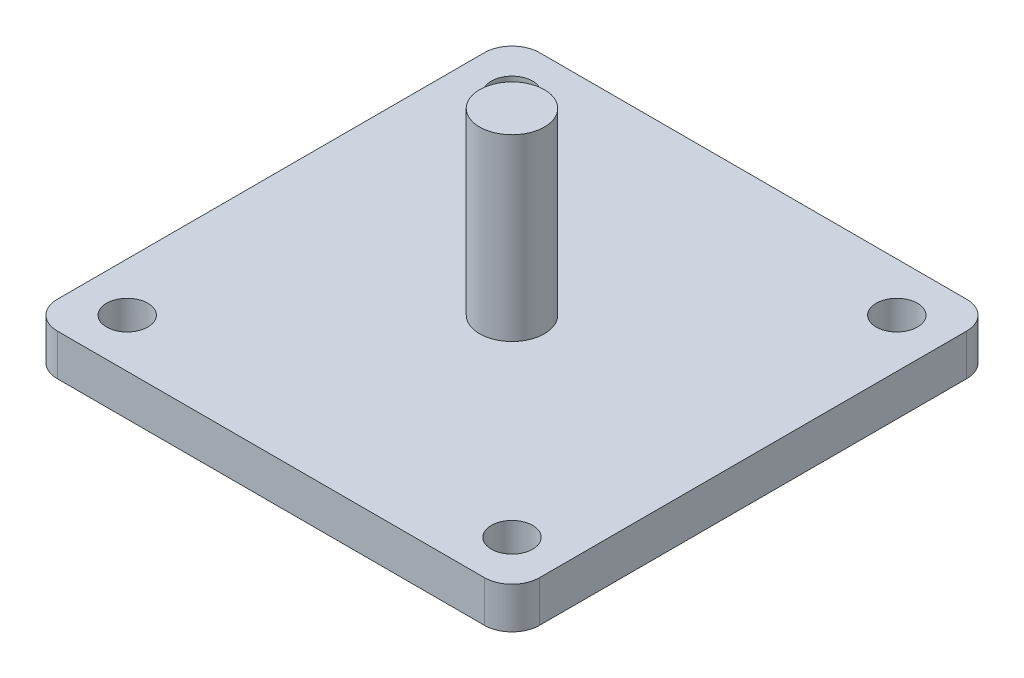
ISO-10303-21;
HEADER;
FILE_DESCRIPTION(('STEP AP214'),'2;1');
FILE_NAME('part.step','',(''),(''),'','','');
FILE_SCHEMA(('AUTOMOTIVE_DESIGN { 1 0 10303 214 1 1 1 1 }'));
ENDSEC;
DATA;
#1=APPLICATION_CONTEXT('core data for automotive mechanical design processes');
#2=APPLICATION_PROTOCOL_DEFINITION('international standard','automotive_design',2000,#1);
#3=PRODUCT_CONTEXT('',#1,'mechanical');
#4=PRODUCT('Part','Part','',(#3));
#5=PRODUCT_RELATED_PRODUCT_CATEGORY('part','',(#4));
#6=PRODUCT_DEFINITION_FORMATION('','',#4);
#7=PRODUCT_DEFINITION_CONTEXT('part definition',#1,'design');
#8=PRODUCT_DEFINITION('design','',#6,#7);
#9=PRODUCT_DEFINITION_SHAPE('','',#8);
#10=(LENGTH_UNIT() NAMED_UNIT(*) SI_UNIT(.MILLI.,.METRE.));
#11=(NAMED_UNIT(*) PLANE_ANGLE_UNIT() SI_UNIT($,.RADIAN.));
#12=(NAMED_UNIT(*) SI_UNIT($,.STERADIAN.) SOLID_ANGLE_UNIT());
#13=UNCERTAINTY_MEASURE_WITH_UNIT(LENGTH_MEASURE(1.E-05),#10,'distance_accuracy_value','');
#14=(GEOMETRIC_REPRESENTATION_CONTEXT(3) GLOBAL_UNCERTAINTY_ASSIGNED_CONTEXT((#13)) GLOBAL_UNIT_ASSIGNED_CONTEXT((#10,
#11,#12)) REPRESENTATION_CONTEXT('',''));
#15=CARTESIAN_POINT('',(0.,0.,0.));
#16=DIRECTION('',(0.,0.,1.));
#17=DIRECTION('',(1.,0.,0.));
#18=AXIS2_PLACEMENT_3D('',#15,#16,#17);
#19=CARTESIAN_POINT('',(17.5,1.5,17.5));
#20=DIRECTION('',(-1.,0.,0.));
#21=DIRECTION('',(0.,0.,1.));
#22=AXIS2_PLACEMENT_3D('',#19,#20,#21);
#23=PLANE('',#22);
#24=DIRECTION('',(0.,0.,-1.));
#25=VECTOR('',#24,1.);
#26=CARTESIAN_POINT('',(17.5,-1.5,17.5));
#27=LINE('',#26,#25);
#28=CARTESIAN_POINT('',(17.5,-1.5,15.5));
#29=VERTEX_POINT('',#28);
#30=CARTESIAN_POINT('',(17.5,-1.5,-15.5));
#31=VERTEX_POINT('',#30);
#32=EDGE_CURVE('E182',#29,#31,#27,.T.);
#33=ORIENTED_EDGE('',*,*,#32,.T.);
#34=DIRECTION('',(0.,-1.,0.));
#35=VECTOR('',#34,1.);
#36=CARTESIAN_POINT('',(17.5,1.5,-15.5));
#37=LINE('',#36,#35);
#38=CARTESIAN_POINT('',(17.5,1.5,-15.5));
#39=VERTEX_POINT('',#38);
#40=EDGE_CURVE('E48',#31,#39,#37,.F.);
#41=ORIENTED_EDGE('',*,*,#40,.T.);
#42=DIRECTION('',(0.,0.,-1.));
#43=VECTOR('',#42,1.);
#44=CARTESIAN_POINT('',(17.5,1.5,17.5));
#45=LINE('',#44,#43);
#46=CARTESIAN_POINT('',(17.5,1.5,15.5));
#47=VERTEX_POINT('',#46);
#48=EDGE_CURVE('E133',#47,#39,#45,.T.);
#49=ORIENTED_EDGE('',*,*,#48,.F.);
#50=DIRECTION('',(0.,-1.,0.));
#51=VECTOR('',#50,1.);
#52=CARTESIAN_POINT('',(17.5,1.5,15.5));
#53=LINE('',#52,#51);
#54=EDGE_CURVE('E165',#47,#29,#53,.T.);
#55=ORIENTED_EDGE('',*,*,#54,.T.);
#56=EDGE_LOOP('',(#33,#41,#49,#55));
#57=FACE_BOUND('',#56,.T.);
#58=ADVANCED_FACE('F39',(#57),#23,.F.);
#59=CARTESIAN_POINT('',(-17.5,1.5,-17.5));
#60=DIRECTION('',(0.,0.,1.));
#61=DIRECTION('',(1.,0.,0.));
#62=AXIS2_PLACEMENT_3D('',#59,#60,#61);
#63=PLANE('',#62);
#64=DIRECTION('',(-1.,0.,0.));
#65=VECTOR('',#64,1.);
#66=CARTESIAN_POINT('',(-17.5,-1.5,-17.5));
#67=LINE('',#66,#65);
#68=CARTESIAN_POINT('',(15.5,-1.5,-17.5));
#69=VERTEX_POINT('',#68);
#70=CARTESIAN_POINT('',(-15.5,-1.5,-17.5));
#71=VERTEX_POINT('',#70);
#72=EDGE_CURVE('E140',#69,#71,#67,.T.);
#73=ORIENTED_EDGE('',*,*,#72,.T.);
#74=DIRECTION('',(0.,-1.,0.));
#75=VECTOR('',#74,1.);
#76=CARTESIAN_POINT('',(-15.5,1.5,-17.5));
#77=LINE('',#76,#75);
#78=CARTESIAN_POINT('',(-15.5,1.5,-17.5));
#79=VERTEX_POINT('',#78);
#80=EDGE_CURVE('E57',#71,#79,#77,.F.);
#81=ORIENTED_EDGE('',*,*,#80,.T.);
#82=DIRECTION('',(-1.,0.,0.));
#83=VECTOR('',#82,1.);
#84=CARTESIAN_POINT('',(-17.5,1.5,-17.5));
#85=LINE('',#84,#83);
#86=CARTESIAN_POINT('',(15.5,1.5,-17.5));
#87=VERTEX_POINT('',#86);
#88=EDGE_CURVE('E139',#87,#79,#85,.T.);
#89=ORIENTED_EDGE('',*,*,#88,.F.);
#90=DIRECTION('',(0.,-1.,0.));
#91=VECTOR('',#90,1.);
#92=CARTESIAN_POINT('',(15.5,1.5,-17.5));
#93=LINE('',#92,#91);
#94=EDGE_CURVE('E158',#87,#69,#93,.T.);
#95=ORIENTED_EDGE('',*,*,#94,.T.);
#96=EDGE_LOOP('',(#73,#81,#89,#95));
#97=FACE_BOUND('',#96,.T.);
#98=ADVANCED_FACE('F191',(#97),#63,.F.);
#99=CARTESIAN_POINT('',(-17.5,1.5,17.5));
#100=DIRECTION('',(1.,0.,0.));
#101=DIRECTION('',(0.,0.,-1.));
#102=AXIS2_PLACEMENT_3D('',#99,#100,#101);
#103=PLANE('',#102);
#104=DIRECTION('',(0.,0.,1.));
#105=VECTOR('',#104,1.);
#106=CARTESIAN_POINT('',(-17.5,-1.5,17.5));
#107=LINE('',#106,#105);
#108=CARTESIAN_POINT('',(-17.5,-1.5,-15.5));
#109=VERTEX_POINT('',#108);
#110=CARTESIAN_POINT('',(-17.5,-1.5,15.5));
#111=VERTEX_POINT('',#110);
#112=EDGE_CURVE('E135',#109,#111,#107,.T.);
#113=ORIENTED_EDGE('',*,*,#112,.T.);
#114=DIRECTION('',(0.,-1.,0.));
#115=VECTOR('',#114,1.);
#116=CARTESIAN_POINT('',(-17.5,1.5,15.5));
#117=LINE('',#116,#115);
#118=CARTESIAN_POINT('',(-17.5,1.5,15.5));
#119=VERTEX_POINT('',#118);
#120=EDGE_CURVE('E114',#111,#119,#117,.F.);
#121=ORIENTED_EDGE('',*,*,#120,.T.);
#122=DIRECTION('',(0.,0.,1.));
#123=VECTOR('',#122,1.);
#124=CARTESIAN_POINT('',(-17.5,1.5,17.5));
#125=LINE('',#124,#123);
#126=CARTESIAN_POINT('',(-17.5,1.5,-15.5));
#127=VERTEX_POINT('',#126);
#128=EDGE_CURVE('E193',#127,#119,#125,.T.);
#129=ORIENTED_EDGE('',*,*,#128,.F.);
#130=DIRECTION('',(0.,-1.,0.));
#131=VECTOR('',#130,1.);
#132=CARTESIAN_POINT('',(-17.5,1.5,-15.5));
#133=LINE('',#132,#131);
#134=EDGE_CURVE('E119',#127,#109,#133,.T.);
#135=ORIENTED_EDGE('',*,*,#134,.T.);
#136=EDGE_LOOP('',(#113,#121,#129,#135));
#137=FACE_BOUND('',#136,.T.);
#138=ADVANCED_FACE('F204',(#137),#103,.F.);
#139=CARTESIAN_POINT('',(-17.5,1.5,17.5));
#140=DIRECTION('',(0.,0.,-1.));
#141=DIRECTION('',(-1.,0.,0.));
#142=AXIS2_PLACEMENT_3D('',#139,#140,#141);
#143=PLANE('',#142);
#144=DIRECTION('',(1.,0.,0.));
#145=VECTOR('',#144,1.);
#146=CARTESIAN_POINT('',(-17.5,1.5,17.5));
#147=LINE('',#146,#145);
#148=CARTESIAN_POINT('',(-15.5,1.5,17.5));
#149=VERTEX_POINT('',#148);
#150=CARTESIAN_POINT('',(15.5,1.5,17.5));
#151=VERTEX_POINT('',#150);
#152=EDGE_CURVE('E126',#149,#151,#147,.T.);
#153=ORIENTED_EDGE('',*,*,#152,.F.);
#154=DIRECTION('',(0.,-1.,0.));
#155=VECTOR('',#154,1.);
#156=CARTESIAN_POINT('',(-15.5,1.5,17.5));
#157=LINE('',#156,#155);
#158=CARTESIAN_POINT('',(-15.5,-1.5,17.5));
#159=VERTEX_POINT('',#158);
#160=EDGE_CURVE('E115',#149,#159,#157,.T.);
#161=ORIENTED_EDGE('',*,*,#160,.T.);
#162=DIRECTION('',(1.,0.,0.));
#163=VECTOR('',#162,1.);
#164=CARTESIAN_POINT('',(-17.5,-1.5,17.5));
#165=LINE('',#164,#163);
#166=CARTESIAN_POINT('',(15.5,-1.5,17.5));
#167=VERTEX_POINT('',#166);
#168=EDGE_CURVE('E121',#159,#167,#165,.T.);
#169=ORIENTED_EDGE('',*,*,#168,.T.);
#170=DIRECTION('',(0.,-1.,0.));
#171=VECTOR('',#170,1.);
#172=CARTESIAN_POINT('',(15.5,1.5,17.5));
#173=LINE('',#172,#171);
#174=EDGE_CURVE('E128',#167,#151,#173,.F.);
#175=ORIENTED_EDGE('',*,*,#174,.T.);
#176=EDGE_LOOP('',(#153,#161,#169,#175));
#177=FACE_BOUND('',#176,.T.);
#178=ADVANCED_FACE('F125',(#177),#143,.F.);
#179=CARTESIAN_POINT('',(0.,1.5,0.));
#180=DIRECTION('',(0.,-1.,0.));
#181=DIRECTION('',(0.,0.,-1.));
#182=AXIS2_PLACEMENT_3D('',#179,#180,#181);
#183=PLANE('',#182);
#184=CARTESIAN_POINT('',(-13.9644660940671,1.5,-13.9644660940675));
#185=DIRECTION('',(0.,1.,0.));
#186=DIRECTION('',(0.,0.,1.));
#187=AXIS2_PLACEMENT_3D('',#184,#185,#186);
#188=CIRCLE('',#187,1.5);
#189=CARTESIAN_POINT('',(-13.9644660940671,1.5,-12.4644660940675));
#190=VERTEX_POINT('',#189);
#191=EDGE_CURVE('E273',#190,#190,#188,.T.);
#192=ORIENTED_EDGE('',*,*,#191,.F.);
#193=EDGE_LOOP('',(#192));
#194=FACE_BOUND('',#193,.T.);
#195=CARTESIAN_POINT('',(-13.9644660940674,1.5,13.9644660940671));
#196=DIRECTION('',(0.,1.,0.));
#197=DIRECTION('',(0.,0.,1.));
#198=AXIS2_PLACEMENT_3D('',#195,#196,#197);
#199=CIRCLE('',#198,1.5);
#200=CARTESIAN_POINT('',(-13.9644660940674,1.5,15.4644660940671));
#201=VERTEX_POINT('',#200);
#202=EDGE_CURVE('E267',#201,#201,#199,.T.);
#203=ORIENTED_EDGE('',*,*,#202,.F.);
#204=EDGE_LOOP('',(#203));
#205=FACE_BOUND('',#204,.T.);
#206=CARTESIAN_POINT('',(13.9644660940672,1.5,13.9644660940674));
#207=DIRECTION('',(0.,1.,0.));
#208=DIRECTION('',(0.,0.,1.));
#209=AXIS2_PLACEMENT_3D('',#206,#207,#208);
#210=CIRCLE('',#209,1.5);
#211=CARTESIAN_POINT('',(13.9644660940672,1.5,15.4644660940674));
#212=VERTEX_POINT('',#211);
#213=EDGE_CURVE('E270',#212,#212,#210,.T.);
#214=ORIENTED_EDGE('',*,*,#213,.F.);
#215=EDGE_LOOP('',(#214));
#216=FACE_BOUND('',#215,.T.);
#217=CARTESIAN_POINT('',(13.9644660940673,1.5,-13.9644660940672));
#218=DIRECTION('',(0.,1.,0.));
#219=DIRECTION('',(0.,0.,1.));
#220=AXIS2_PLACEMENT_3D('',#217,#218,#219);
#221=CIRCLE('',#220,1.5);
#222=CARTESIAN_POINT('',(13.9644660940673,1.5,-12.4644660940672));
#223=VERTEX_POINT('',#222);
#224=EDGE_CURVE('E168',#223,#223,#221,.T.);
#225=ORIENTED_EDGE('',*,*,#224,.F.);
#226=EDGE_LOOP('',(#225));
#227=FACE_BOUND('',#226,.T.);
#228=CARTESIAN_POINT('',(0.,1.5,0.));
#229=DIRECTION('',(0.,-1.,0.));
#230=DIRECTION('',(0.,0.,-1.));
#231=AXIS2_PLACEMENT_3D('',#228,#229,#230);
#232=CIRCLE('',#231,2.35);
#233=CARTESIAN_POINT('',(0.,1.5,-2.35));
#234=VERTEX_POINT('',#233);
#235=EDGE_CURVE('E11',#234,#234,#232,.F.);
#236=ORIENTED_EDGE('',*,*,#235,.F.);
#237=EDGE_LOOP('',(#236));
#238=FACE_BOUND('',#237,.T.);
#239=ORIENTED_EDGE('',*,*,#128,.T.);
#240=CARTESIAN_POINT('',(-15.5,1.5,15.5));
#241=DIRECTION('',(0.,-1.,0.));
#242=DIRECTION('',(0.,0.,-1.));
#243=AXIS2_PLACEMENT_3D('',#240,#241,#242);
#244=CIRCLE('',#243,2.);
#245=EDGE_CURVE('E156',#119,#149,#244,.F.);
#246=ORIENTED_EDGE('',*,*,#245,.T.);
#247=ORIENTED_EDGE('',*,*,#152,.T.);
#248=CARTESIAN_POINT('',(15.5,1.5,15.5));
#249=DIRECTION('',(0.,-1.,0.));
#250=DIRECTION('',(0.,0.,-1.));
#251=AXIS2_PLACEMENT_3D('',#248,#249,#250);
#252=CIRCLE('',#251,2.);
#253=EDGE_CURVE('E151',#151,#47,#252,.F.);
#254=ORIENTED_EDGE('',*,*,#253,.T.);
#255=ORIENTED_EDGE('',*,*,#48,.T.);
#256=CARTESIAN_POINT('',(15.5,1.5,-15.5));
#257=DIRECTION('',(0.,-1.,0.));
#258=DIRECTION('',(0.,0.,-1.));
#259=AXIS2_PLACEMENT_3D('',#256,#257,#258);
#260=CIRCLE('',#259,2.);
#261=EDGE_CURVE('E64',#39,#87,#260,.F.);
#262=ORIENTED_EDGE('',*,*,#261,.T.);
#263=ORIENTED_EDGE('',*,*,#88,.T.);
#264=CARTESIAN_POINT('',(-15.5,1.5,-15.5));
#265=DIRECTION('',(0.,-1.,0.));
#266=DIRECTION('',(0.,0.,-1.));
#267=AXIS2_PLACEMENT_3D('',#264,#265,#266);
#268=CIRCLE('',#267,2.);
#269=EDGE_CURVE('E152',#79,#127,#268,.F.);
#270=ORIENTED_EDGE('',*,*,#269,.T.);
#271=EDGE_LOOP('',(#239,#246,#247,#254,#255,#262,#263,#270));
#272=FACE_BOUND('',#271,.T.);
#273=ADVANCED_FACE('F205',(#194,#205,#216,#227,#238,#272),#183,.F.);
#274=CARTESIAN_POINT('',(0.,-1.5,0.));
#275=DIRECTION('',(0.,-1.,0.));
#276=DIRECTION('',(0.,0.,-1.));
#277=AXIS2_PLACEMENT_3D('',#274,#275,#276);
#278=PLANE('',#277);
#279=CARTESIAN_POINT('',(-13.9644660940671,-1.5,-13.9644660940675));
#280=DIRECTION('',(0.,-1.,0.));
#281=DIRECTION('',(0.,0.,-1.));
#282=AXIS2_PLACEMENT_3D('',#279,#280,#281);
#283=CIRCLE('',#282,1.5);
#284=CARTESIAN_POINT('',(-13.9644660940671,-1.5,-15.4644660940675));
#285=VERTEX_POINT('',#284);
#286=EDGE_CURVE('E43',#285,#285,#283,.T.);
#287=ORIENTED_EDGE('',*,*,#286,.F.);
#288=EDGE_LOOP('',(#287));
#289=FACE_BOUND('',#288,.T.);
#290=CARTESIAN_POINT('',(-13.9644660940674,-1.5,13.9644660940671));
#291=DIRECTION('',(0.,-1.,0.));
#292=DIRECTION('',(0.,0.,-1.));
#293=AXIS2_PLACEMENT_3D('',#290,#291,#292);
#294=CIRCLE('',#293,1.5);
#295=CARTESIAN_POINT('',(-13.9644660940674,-1.5,12.4644660940671));
#296=VERTEX_POINT('',#295);
#297=EDGE_CURVE('E172',#296,#296,#294,.T.);
#298=ORIENTED_EDGE('',*,*,#297,.F.);
#299=EDGE_LOOP('',(#298));
#300=FACE_BOUND('',#299,.T.);
#301=CARTESIAN_POINT('',(13.9644660940672,-1.5,13.9644660940674));
#302=DIRECTION('',(0.,-1.,0.));
#303=DIRECTION('',(0.,0.,-1.));
#304=AXIS2_PLACEMENT_3D('',#301,#302,#303);
#305=CIRCLE('',#304,1.5);
#306=CARTESIAN_POINT('',(13.9644660940672,-1.5,12.4644660940674));
#307=VERTEX_POINT('',#306);
#308=EDGE_CURVE('E166',#307,#307,#305,.T.);
#309=ORIENTED_EDGE('',*,*,#308,.F.);
#310=EDGE_LOOP('',(#309));
#311=FACE_BOUND('',#310,.T.);
#312=CARTESIAN_POINT('',(13.9644660940673,-1.5,-13.9644660940672));
#313=DIRECTION('',(0.,-1.,0.));
#314=DIRECTION('',(0.,0.,-1.));
#315=AXIS2_PLACEMENT_3D('',#312,#313,#314);
#316=CIRCLE('',#315,1.5);
#317=CARTESIAN_POINT('',(13.9644660940673,-1.5,-15.4644660940672));
#318=VERTEX_POINT('',#317);
#319=EDGE_CURVE('E167',#318,#318,#316,.T.);
#320=ORIENTED_EDGE('',*,*,#319,.F.);
#321=EDGE_LOOP('',(#320));
#322=FACE_BOUND('',#321,.T.);
#323=ORIENTED_EDGE('',*,*,#168,.F.);
#324=CARTESIAN_POINT('',(-15.5,-1.5,15.5));
#325=DIRECTION('',(0.,-1.,0.));
#326=DIRECTION('',(0.,0.,-1.));
#327=AXIS2_PLACEMENT_3D('',#324,#325,#326);
#328=CIRCLE('',#327,2.);
#329=EDGE_CURVE('E107',#159,#111,#328,.T.);
#330=ORIENTED_EDGE('',*,*,#329,.T.);
#331=ORIENTED_EDGE('',*,*,#112,.F.);
#332=CARTESIAN_POINT('',(-15.5,-1.5,-15.5));
#333=DIRECTION('',(0.,-1.,0.));
#334=DIRECTION('',(0.,0.,-1.));
#335=AXIS2_PLACEMENT_3D('',#332,#333,#334);
#336=CIRCLE('',#335,2.);
#337=EDGE_CURVE('E118',#109,#71,#336,.T.);
#338=ORIENTED_EDGE('',*,*,#337,.T.);
#339=ORIENTED_EDGE('',*,*,#72,.F.);
#340=CARTESIAN_POINT('',(15.5,-1.5,-15.5));
#341=DIRECTION('',(0.,-1.,0.));
#342=DIRECTION('',(0.,0.,-1.));
#343=AXIS2_PLACEMENT_3D('',#340,#341,#342);
#344=CIRCLE('',#343,2.);
#345=EDGE_CURVE('E144',#69,#31,#344,.T.);
#346=ORIENTED_EDGE('',*,*,#345,.T.);
#347=ORIENTED_EDGE('',*,*,#32,.F.);
#348=CARTESIAN_POINT('',(15.5,-1.5,15.5));
#349=DIRECTION('',(0.,-1.,0.));
#350=DIRECTION('',(0.,0.,-1.));
#351=AXIS2_PLACEMENT_3D('',#348,#349,#350);
#352=CIRCLE('',#351,2.);
#353=EDGE_CURVE('E129',#29,#167,#352,.T.);
#354=ORIENTED_EDGE('',*,*,#353,.T.);
#355=EDGE_LOOP('',(#323,#330,#331,#338,#339,#346,#347,#354));
#356=FACE_BOUND('',#355,.T.);
#357=ADVANCED_FACE('F132',(#289,#300,#311,#322,#356),#278,.T.);
#358=CARTESIAN_POINT('',(-15.5,1.5,15.5));
#359=DIRECTION('',(0.,-1.,0.));
#360=DIRECTION('',(0.,0.,-1.));
#361=AXIS2_PLACEMENT_3D('',#358,#359,#360);
#362=CYLINDRICAL_SURFACE('',#361,2.);
#363=ORIENTED_EDGE('',*,*,#245,.F.);
#364=ORIENTED_EDGE('',*,*,#120,.F.);
#365=ORIENTED_EDGE('',*,*,#329,.F.);
#366=ORIENTED_EDGE('',*,*,#160,.F.);
#367=EDGE_LOOP('',(#363,#364,#365,#366));
#368=FACE_BOUND('',#367,.T.);
#369=ADVANCED_FACE('F112',(#368),#362,.T.);
#370=CARTESIAN_POINT('',(-15.5,1.5,-15.5));
#371=DIRECTION('',(0.,-1.,0.));
#372=DIRECTION('',(0.,0.,-1.));
#373=AXIS2_PLACEMENT_3D('',#370,#371,#372);
#374=CYLINDRICAL_SURFACE('',#373,2.);
#375=ORIENTED_EDGE('',*,*,#269,.F.);
#376=ORIENTED_EDGE('',*,*,#80,.F.);
#377=ORIENTED_EDGE('',*,*,#337,.F.);
#378=ORIENTED_EDGE('',*,*,#134,.F.);
#379=EDGE_LOOP('',(#375,#376,#377,#378));
#380=FACE_BOUND('',#379,.T.);
#381=ADVANCED_FACE('F200',(#380),#374,.T.);
#382=CARTESIAN_POINT('',(15.5,1.5,-15.5));
#383=DIRECTION('',(0.,-1.,0.));
#384=DIRECTION('',(0.,0.,-1.));
#385=AXIS2_PLACEMENT_3D('',#382,#383,#384);
#386=CYLINDRICAL_SURFACE('',#385,2.);
#387=ORIENTED_EDGE('',*,*,#261,.F.);
#388=ORIENTED_EDGE('',*,*,#40,.F.);
#389=ORIENTED_EDGE('',*,*,#345,.F.);
#390=ORIENTED_EDGE('',*,*,#94,.F.);
#391=EDGE_LOOP('',(#387,#388,#389,#390));
#392=FACE_BOUND('',#391,.T.);
#393=ADVANCED_FACE('F225',(#392),#386,.T.);
#394=CARTESIAN_POINT('',(15.5,1.5,15.5));
#395=DIRECTION('',(0.,-1.,0.));
#396=DIRECTION('',(0.,0.,-1.));
#397=AXIS2_PLACEMENT_3D('',#394,#395,#396);
#398=CYLINDRICAL_SURFACE('',#397,2.);
#399=ORIENTED_EDGE('',*,*,#253,.F.);
#400=ORIENTED_EDGE('',*,*,#174,.F.);
#401=ORIENTED_EDGE('',*,*,#353,.F.);
#402=ORIENTED_EDGE('',*,*,#54,.F.);
#403=EDGE_LOOP('',(#399,#400,#401,#402));
#404=FACE_BOUND('',#403,.T.);
#405=ADVANCED_FACE('F41',(#404),#398,.T.);
#406=CARTESIAN_POINT('',(0.,14.5,0.));
#407=DIRECTION('',(0.,-1.,0.));
#408=DIRECTION('',(0.,0.,-1.));
#409=AXIS2_PLACEMENT_3D('',#406,#407,#408);
#410=CYLINDRICAL_SURFACE('',#409,2.35);
#411=CARTESIAN_POINT('',(0.,14.5,0.));
#412=DIRECTION('',(0.,1.,0.));
#413=DIRECTION('',(0.,0.,1.));
#414=AXIS2_PLACEMENT_3D('',#411,#412,#413);
#415=CIRCLE('',#414,2.35);
#416=CARTESIAN_POINT('',(0.,14.5,-2.35));
#417=VERTEX_POINT('',#416);
#418=EDGE_CURVE('E179',#417,#417,#415,.T.);
#419=CARTESIAN_POINT('',(0.,14.5,-2.35));
#420=CARTESIAN_POINT('',(0.,14.3645833333333,-2.35));
#421=CARTESIAN_POINT('',(0.,14.2291666666667,-2.35));
#422=CARTESIAN_POINT('',(0.,13.9583333333333,-2.35));
#423=CARTESIAN_POINT('',(0.,13.8229166666667,-2.35));
#424=CARTESIAN_POINT('',(0.,13.5520833333333,-2.35));
#425=CARTESIAN_POINT('',(0.,13.4166666666667,-2.35));
#426=CARTESIAN_POINT('',(0.,13.1458333333333,-2.35));
#427=CARTESIAN_POINT('',(0.,13.0104166666667,-2.35));
#428=CARTESIAN_POINT('',(0.,12.7395833333333,-2.35));
#429=CARTESIAN_POINT('',(0.,12.6041666666667,-2.35));
#430=CARTESIAN_POINT('',(0.,12.3333333333333,-2.35));
#431=CARTESIAN_POINT('',(0.,12.1979166666667,-2.35));
#432=CARTESIAN_POINT('',(0.,11.9270833333333,-2.35));
#433=CARTESIAN_POINT('',(0.,11.7916666666667,-2.35));
#434=CARTESIAN_POINT('',(0.,11.5208333333333,-2.35));
#435=CARTESIAN_POINT('',(0.,11.3854166666667,-2.35));
#436=CARTESIAN_POINT('',(0.,11.1145833333333,-2.35));
#437=CARTESIAN_POINT('',(0.,10.9791666666667,-2.35));
#438=CARTESIAN_POINT('',(0.,10.7083333333333,-2.35));
#439=CARTESIAN_POINT('',(0.,10.5729166666667,-2.35));
#440=CARTESIAN_POINT('',(0.,10.3020833333333,-2.35));
#441=CARTESIAN_POINT('',(0.,10.1666666666667,-2.35));
#442=CARTESIAN_POINT('',(0.,9.89583333333333,-2.35));
#443=CARTESIAN_POINT('',(0.,9.76041666666667,-2.35));
#444=CARTESIAN_POINT('',(0.,9.48958333333333,-2.35));
#445=CARTESIAN_POINT('',(0.,9.35416666666666,-2.35));
#446=CARTESIAN_POINT('',(0.,9.08333333333333,-2.35));
#447=CARTESIAN_POINT('',(0.,8.94791666666666,-2.35));
#448=CARTESIAN_POINT('',(0.,8.67708333333333,-2.35));
#449=CARTESIAN_POINT('',(0.,8.54166666666666,-2.35));
#450=CARTESIAN_POINT('',(0.,8.27083333333333,-2.35));
#451=CARTESIAN_POINT('',(0.,8.13541666666667,-2.35));
#452=CARTESIAN_POINT('',(0.,7.86458333333333,-2.35));
#453=CARTESIAN_POINT('',(0.,7.72916666666666,-2.35));
#454=CARTESIAN_POINT('',(0.,7.45833333333333,-2.35));
#455=CARTESIAN_POINT('',(0.,7.32291666666667,-2.35));
#456=CARTESIAN_POINT('',(0.,7.05208333333333,-2.35));
#457=CARTESIAN_POINT('',(0.,6.91666666666666,-2.35));
#458=CARTESIAN_POINT('',(0.,6.64583333333333,-2.35));
#459=CARTESIAN_POINT('',(0.,6.51041666666667,-2.35));
#460=CARTESIAN_POINT('',(0.,6.23958333333333,-2.35));
#461=CARTESIAN_POINT('',(0.,6.10416666666667,-2.35));
#462=CARTESIAN_POINT('',(0.,5.83333333333333,-2.35));
#463=CARTESIAN_POINT('',(0.,5.69791666666667,-2.35));
#464=CARTESIAN_POINT('',(0.,5.42708333333333,-2.35));
#465=CARTESIAN_POINT('',(0.,5.29166666666667,-2.35));
#466=CARTESIAN_POINT('',(0.,5.02083333333333,-2.35));
#467=CARTESIAN_POINT('',(0.,4.88541666666667,-2.35));
#468=CARTESIAN_POINT('',(0.,4.61458333333333,-2.35));
#469=CARTESIAN_POINT('',(0.,4.47916666666667,-2.35));
#470=CARTESIAN_POINT('',(0.,4.20833333333333,-2.35));
#471=CARTESIAN_POINT('',(0.,4.07291666666667,-2.35));
#472=CARTESIAN_POINT('',(0.,3.80208333333333,-2.35));
#473=CARTESIAN_POINT('',(0.,3.66666666666667,-2.35));
#474=CARTESIAN_POINT('',(0.,3.39583333333333,-2.35));
#475=CARTESIAN_POINT('',(0.,3.26041666666667,-2.35));
#476=CARTESIAN_POINT('',(0.,2.98958333333333,-2.35));
#477=CARTESIAN_POINT('',(0.,2.85416666666667,-2.35));
#478=CARTESIAN_POINT('',(0.,2.58333333333333,-2.35));
#479=CARTESIAN_POINT('',(0.,2.44791666666667,-2.35));
#480=CARTESIAN_POINT('',(0.,2.17708333333333,-2.35));
#481=CARTESIAN_POINT('',(0.,2.04166666666667,-2.35));
#482=CARTESIAN_POINT('',(0.,1.77083333333333,-2.35));
#483=CARTESIAN_POINT('',(0.,1.63541666666667,-2.35));
#484=CARTESIAN_POINT('',(0.,1.5,-2.35));
#485=B_SPLINE_CURVE_WITH_KNOTS('',3,(#419,#420,#421,#422,#423,#424,#425,#426,#427,#428,#429,
#430,#431,#432,#433,#434,#435,#436,#437,#438,#439,#440,#441,#442,#443,#444,#445,#446,#447,#448,
#449,#450,#451,#452,#453,#454,#455,#456,#457,#458,#459,#460,#461,#462,#463,#464,#465,#466,#467,
#468,#469,#470,#471,#472,#473,#474,#475,#476,#477,#478,#479,#480,#481,#482,#483,#484),
.UNSPECIFIED.,.F.,.F.,(4,2,2,2,2,2,2,2,2,2,2,2,2,2,2,2,2,2,2,2,2,2,2,2,2,2,2,2,2,2,2,2,4),(0.,
0.40625,0.812500000000001,1.21875,1.625,2.03125,2.4375,2.84375,3.25,3.65625,4.0625,4.46875,
4.875,5.28125,5.6875,6.09375,6.5,6.90625,7.3125,7.71875,8.125,8.53125,8.9375,9.34375,9.75,
10.15625,10.5625,10.96875,11.375,11.78125,12.1875,12.59375,13.),.UNSPECIFIED.);
#486=EDGE_CURVE('BSEAM229',#417,#234,#485,.T.);
#487=ORIENTED_EDGE('',*,*,#418,.F.);
#488=ORIENTED_EDGE('',*,*,#235,.T.);
#489=ORIENTED_EDGE('',*,*,#486,.T.);
#490=ORIENTED_EDGE('',*,*,#486,.F.);
#491=EDGE_LOOP('',(#487,#489,#488,#490));
#492=FACE_BOUND('',#491,.T.);
#493=ADVANCED_FACE('F229',(#492),#410,.T.);
#494=CARTESIAN_POINT('',(0.,14.5,0.));
#495=DIRECTION('',(0.,1.,0.));
#496=DIRECTION('',(0.,0.,1.));
#497=AXIS2_PLACEMENT_3D('',#494,#495,#496);
#498=PLANE('',#497);
#499=ORIENTED_EDGE('',*,*,#418,.T.);
#500=EDGE_LOOP('',(#499));
#501=FACE_BOUND('',#500,.T.);
#502=ADVANCED_FACE('F240',(#501),#498,.T.);
#503=CARTESIAN_POINT('',(13.9644660940673,-8.5,-13.9644660940672));
#504=DIRECTION('',(0.,1.,0.));
#505=DIRECTION('',(0.,0.,1.));
#506=AXIS2_PLACEMENT_3D('',#503,#504,#505);
#507=CYLINDRICAL_SURFACE('',#506,1.5);
#508=ORIENTED_EDGE('',*,*,#319,.T.);
#509=EDGE_LOOP('',(#508));
#510=FACE_BOUND('',#509,.T.);
#511=ORIENTED_EDGE('',*,*,#224,.T.);
#512=EDGE_LOOP('',(#511));
#513=FACE_BOUND('',#512,.T.);
#514=ADVANCED_FACE('F244',(#510,#513),#507,.F.);
#515=CARTESIAN_POINT('',(13.9644660940672,-8.5,13.9644660940674));
#516=DIRECTION('',(0.,1.,0.));
#517=DIRECTION('',(0.,0.,1.));
#518=AXIS2_PLACEMENT_3D('',#515,#516,#517);
#519=CYLINDRICAL_SURFACE('',#518,1.5);
#520=ORIENTED_EDGE('',*,*,#308,.T.);
#521=EDGE_LOOP('',(#520));
#522=FACE_BOUND('',#521,.T.);
#523=ORIENTED_EDGE('',*,*,#213,.T.);
#524=EDGE_LOOP('',(#523));
#525=FACE_BOUND('',#524,.T.);
#526=ADVANCED_FACE('F263',(#522,#525),#519,.F.);
#527=CARTESIAN_POINT('',(-13.9644660940674,-8.5,13.9644660940671));
#528=DIRECTION('',(0.,1.,0.));
#529=DIRECTION('',(0.,0.,1.));
#530=AXIS2_PLACEMENT_3D('',#527,#528,#529);
#531=CYLINDRICAL_SURFACE('',#530,1.5);
#532=ORIENTED_EDGE('',*,*,#297,.T.);
#533=EDGE_LOOP('',(#532));
#534=FACE_BOUND('',#533,.T.);
#535=ORIENTED_EDGE('',*,*,#202,.T.);
#536=EDGE_LOOP('',(#535));
#537=FACE_BOUND('',#536,.T.);
#538=ADVANCED_FACE('F288',(#534,#537),#531,.F.);
#539=CARTESIAN_POINT('',(-13.9644660940671,-8.5,-13.9644660940675));
#540=DIRECTION('',(0.,1.,0.));
#541=DIRECTION('',(0.,0.,1.));
#542=AXIS2_PLACEMENT_3D('',#539,#540,#541);
#543=CYLINDRICAL_SURFACE('',#542,1.5);
#544=ORIENTED_EDGE('',*,*,#286,.T.);
#545=EDGE_LOOP('',(#544));
#546=FACE_BOUND('',#545,.T.);
#547=ORIENTED_EDGE('',*,*,#191,.T.);
#548=EDGE_LOOP('',(#547));
#549=FACE_BOUND('',#548,.T.);
#550=ADVANCED_FACE('F276',(#546,#549),#543,.F.);
#551=CLOSED_SHELL('',(#58,#98,#138,#178,#273,#357,#369,#381,#393,#405,#493,#502,#514,#526,#538,#550));
#552=MANIFOLD_SOLID_BREP('B2',#551);
#553=ADVANCED_BREP_SHAPE_REPRESENTATION('',(#18,#552),#14);
#554=SHAPE_DEFINITION_REPRESENTATION(#9,#553);
ENDSEC;
END-ISO-10303-21;
